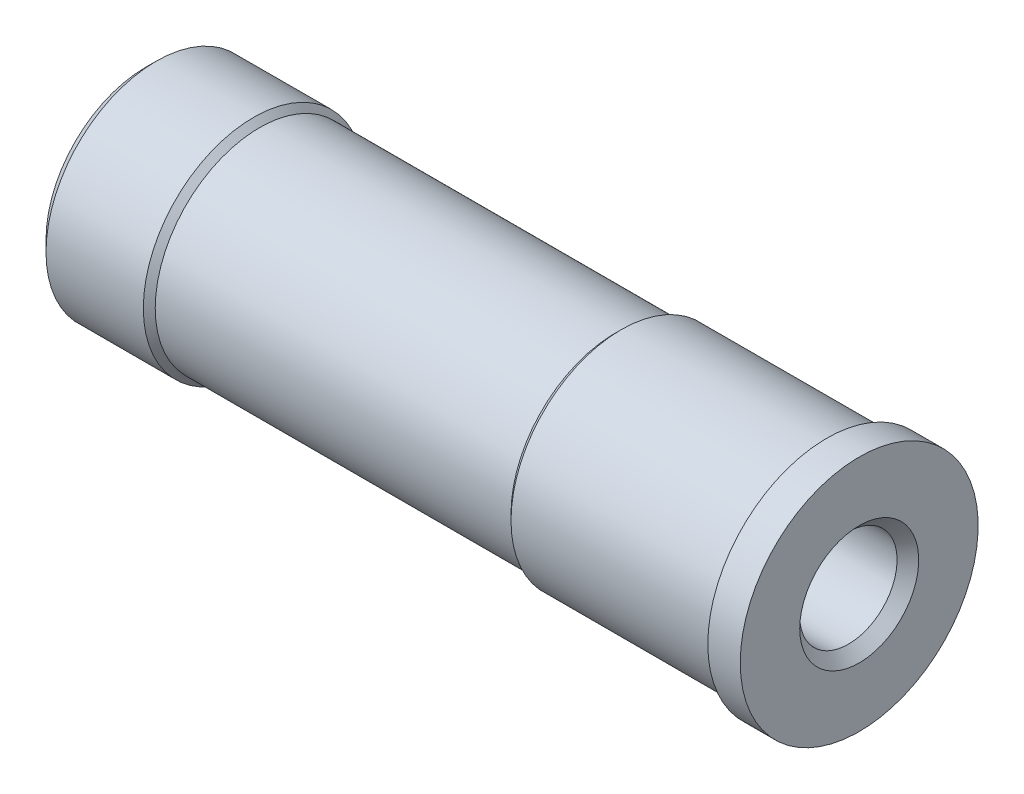
ISO-10303-21;
HEADER;
FILE_DESCRIPTION(('STEP AP214'),'2;1');
FILE_NAME('part.step','',(''),(''),'','','');
FILE_SCHEMA(('AUTOMOTIVE_DESIGN { 1 0 10303 214 1 1 1 1 }'));
ENDSEC;
DATA;
#1=APPLICATION_CONTEXT('core data for automotive mechanical design processes');
#2=APPLICATION_PROTOCOL_DEFINITION('international standard','automotive_design',2000,#1);
#3=PRODUCT_CONTEXT('',#1,'mechanical');
#4=PRODUCT('Part','Part','',(#3));
#5=PRODUCT_RELATED_PRODUCT_CATEGORY('part','',(#4));
#6=PRODUCT_DEFINITION_FORMATION('','',#4);
#7=PRODUCT_DEFINITION_CONTEXT('part definition',#1,'design');
#8=PRODUCT_DEFINITION('design','',#6,#7);
#9=PRODUCT_DEFINITION_SHAPE('','',#8);
#10=(LENGTH_UNIT() NAMED_UNIT(*) SI_UNIT(.MILLI.,.METRE.));
#11=(NAMED_UNIT(*) PLANE_ANGLE_UNIT() SI_UNIT($,.RADIAN.));
#12=(NAMED_UNIT(*) SI_UNIT($,.STERADIAN.) SOLID_ANGLE_UNIT());
#13=UNCERTAINTY_MEASURE_WITH_UNIT(LENGTH_MEASURE(1.E-05),#10,'distance_accuracy_value','');
#14=(GEOMETRIC_REPRESENTATION_CONTEXT(3) GLOBAL_UNCERTAINTY_ASSIGNED_CONTEXT((#13)) GLOBAL_UNIT_ASSIGNED_CONTEXT((#10,
#11,#12)) REPRESENTATION_CONTEXT('',''));
#15=CARTESIAN_POINT('',(0.,0.,0.));
#16=DIRECTION('',(0.,0.,1.));
#17=DIRECTION('',(1.,0.,0.));
#18=AXIS2_PLACEMENT_3D('',#15,#16,#17);
#19=CARTESIAN_POINT('',(0.,0.,0.));
#20=DIRECTION('',(-1.,0.,0.));
#21=DIRECTION('',(0.,0.,1.));
#22=AXIS2_PLACEMENT_3D('',#19,#20,#21);
#23=CYLINDRICAL_SURFACE('',#22,10.2);
#24=CARTESIAN_POINT('',(9.99999999999998,0.,0.));
#25=DIRECTION('',(-1.,0.,0.));
#26=DIRECTION('',(0.,0.,1.));
#27=AXIS2_PLACEMENT_3D('',#24,#25,#26);
#28=CIRCLE('',#27,10.2);
#29=CARTESIAN_POINT('',(9.99999999999998,0.,10.2));
#30=VERTEX_POINT('',#29);
#31=EDGE_CURVE('E63',#30,#30,#28,.T.);
#32=ORIENTED_EDGE('',*,*,#31,.T.);
#33=EDGE_LOOP('',(#32));
#34=FACE_BOUND('',#33,.T.);
#35=CARTESIAN_POINT('',(1.,0.,0.));
#36=DIRECTION('',(1.,0.,0.));
#37=DIRECTION('',(0.,0.,-1.));
#38=AXIS2_PLACEMENT_3D('',#35,#36,#37);
#39=CIRCLE('',#38,10.2);
#40=CARTESIAN_POINT('',(1.,0.,-10.2));
#41=VERTEX_POINT('',#40);
#42=EDGE_CURVE('E66',#41,#41,#39,.T.);
#43=ORIENTED_EDGE('',*,*,#42,.T.);
#44=EDGE_LOOP('',(#43));
#45=FACE_BOUND('',#44,.T.);
#46=ADVANCED_FACE('F33',(#34,#45),#23,.T.);
#47=CARTESIAN_POINT('',(0.,0.,0.));
#48=DIRECTION('',(-1.,0.,0.));
#49=DIRECTION('',(0.,0.,1.));
#50=AXIS2_PLACEMENT_3D('',#47,#48,#49);
#51=CYLINDRICAL_SURFACE('',#50,9.65);
#52=CARTESIAN_POINT('',(43.45,0.,0.));
#53=DIRECTION('',(1.,0.,0.));
#54=DIRECTION('',(0.,0.,-1.));
#55=AXIS2_PLACEMENT_3D('',#52,#53,#54);
#56=CIRCLE('',#55,9.65);
#57=CARTESIAN_POINT('',(43.45,0.,-9.65));
#58=VERTEX_POINT('',#57);
#59=EDGE_CURVE('E54',#58,#58,#56,.F.);
#60=ORIENTED_EDGE('',*,*,#59,.T.);
#61=EDGE_LOOP('',(#60));
#62=FACE_BOUND('',#61,.T.);
#63=CARTESIAN_POINT('',(10.55,0.,0.));
#64=DIRECTION('',(-1.,0.,0.));
#65=DIRECTION('',(0.,0.,1.));
#66=AXIS2_PLACEMENT_3D('',#63,#64,#65);
#67=CIRCLE('',#66,9.65);
#68=CARTESIAN_POINT('',(10.55,0.,9.65));
#69=VERTEX_POINT('',#68);
#70=EDGE_CURVE('E57',#69,#69,#67,.F.);
#71=ORIENTED_EDGE('',*,*,#70,.T.);
#72=EDGE_LOOP('',(#71));
#73=FACE_BOUND('',#72,.T.);
#74=ADVANCED_FACE('F105',(#62,#73),#51,.T.);
#75=CARTESIAN_POINT('',(0.,0.,0.));
#76=DIRECTION('',(-1.,0.,0.));
#77=DIRECTION('',(0.,0.,1.));
#78=AXIS2_PLACEMENT_3D('',#75,#76,#77);
#79=CYLINDRICAL_SURFACE('',#78,10.2);
#80=CARTESIAN_POINT('',(44.,0.,0.));
#81=DIRECTION('',(1.,0.,0.));
#82=DIRECTION('',(0.,0.,-1.));
#83=AXIS2_PLACEMENT_3D('',#80,#81,#82);
#84=CIRCLE('',#83,10.2);
#85=CARTESIAN_POINT('',(44.,0.,-10.2));
#86=VERTEX_POINT('',#85);
#87=EDGE_CURVE('E60',#86,#86,#84,.T.);
#88=ORIENTED_EDGE('',*,*,#87,.T.);
#89=EDGE_LOOP('',(#88));
#90=FACE_BOUND('',#89,.T.);
#91=CARTESIAN_POINT('',(63.,0.,0.));
#92=DIRECTION('',(-1.,0.,0.));
#93=DIRECTION('',(0.,0.,1.));
#94=AXIS2_PLACEMENT_3D('',#91,#92,#93);
#95=CIRCLE('',#94,10.2);
#96=CARTESIAN_POINT('',(63.,0.,10.2));
#97=VERTEX_POINT('',#96);
#98=EDGE_CURVE('E72',#97,#97,#95,.T.);
#99=ORIENTED_EDGE('',*,*,#98,.T.);
#100=EDGE_LOOP('',(#99));
#101=FACE_BOUND('',#100,.T.);
#102=ADVANCED_FACE('F111',(#90,#101),#79,.T.);
#103=CARTESIAN_POINT('',(63.,10.2,0.));
#104=DIRECTION('',(1.,0.,0.));
#105=DIRECTION('',(0.,0.,-1.));
#106=AXIS2_PLACEMENT_3D('',#103,#104,#105);
#107=PLANE('',#106);
#108=ORIENTED_EDGE('',*,*,#98,.F.);
#109=EDGE_LOOP('',(#108));
#110=FACE_BOUND('',#109,.T.);
#111=CARTESIAN_POINT('',(63.,0.,0.));
#112=DIRECTION('',(-1.,0.,0.));
#113=DIRECTION('',(0.,0.,1.));
#114=AXIS2_PLACEMENT_3D('',#111,#112,#113);
#115=CIRCLE('',#114,11.);
#116=CARTESIAN_POINT('',(63.,0.,11.));
#117=VERTEX_POINT('',#116);
#118=EDGE_CURVE('E75',#117,#117,#115,.T.);
#119=ORIENTED_EDGE('',*,*,#118,.T.);
#120=EDGE_LOOP('',(#119));
#121=FACE_BOUND('',#120,.T.);
#122=ADVANCED_FACE('F215',(#110,#121),#107,.F.);
#123=CARTESIAN_POINT('',(0.,0.,0.));
#124=DIRECTION('',(-1.,0.,0.));
#125=DIRECTION('',(0.,0.,1.));
#126=AXIS2_PLACEMENT_3D('',#123,#124,#125);
#127=CYLINDRICAL_SURFACE('',#126,11.);
#128=ORIENTED_EDGE('',*,*,#118,.F.);
#129=EDGE_LOOP('',(#128));
#130=FACE_BOUND('',#129,.T.);
#131=CARTESIAN_POINT('',(66.,0.,0.));
#132=DIRECTION('',(-1.,0.,0.));
#133=DIRECTION('',(0.,0.,1.));
#134=AXIS2_PLACEMENT_3D('',#131,#132,#133);
#135=CIRCLE('',#134,11.);
#136=CARTESIAN_POINT('',(66.,0.,11.));
#137=VERTEX_POINT('',#136);
#138=EDGE_CURVE('E78',#137,#137,#135,.T.);
#139=ORIENTED_EDGE('',*,*,#138,.T.);
#140=EDGE_LOOP('',(#139));
#141=FACE_BOUND('',#140,.T.);
#142=ADVANCED_FACE('F193',(#130,#141),#127,.T.);
#143=CARTESIAN_POINT('',(66.,11.,0.));
#144=DIRECTION('',(-1.,0.,0.));
#145=DIRECTION('',(0.,0.,1.));
#146=AXIS2_PLACEMENT_3D('',#143,#144,#145);
#147=PLANE('',#146);
#148=CARTESIAN_POINT('',(66.,0.,0.));
#149=DIRECTION('',(-1.,0.,0.));
#150=DIRECTION('',(0.,0.,1.));
#151=AXIS2_PLACEMENT_3D('',#148,#149,#150);
#152=CIRCLE('',#151,5.5);
#153=CARTESIAN_POINT('',(66.,0.,5.5));
#154=VERTEX_POINT('',#153);
#155=EDGE_CURVE('E41',#154,#154,#152,.T.);
#156=ORIENTED_EDGE('',*,*,#155,.T.);
#157=EDGE_LOOP('',(#156));
#158=FACE_BOUND('',#157,.T.);
#159=ORIENTED_EDGE('',*,*,#138,.F.);
#160=EDGE_LOOP('',(#159));
#161=FACE_BOUND('',#160,.T.);
#162=ADVANCED_FACE('F182',(#158,#161),#147,.F.);
#163=CARTESIAN_POINT('',(0.,0.,0.));
#164=DIRECTION('',(-1.,0.,0.));
#165=DIRECTION('',(0.,0.,1.));
#166=AXIS2_PLACEMENT_3D('',#163,#164,#165);
#167=CYLINDRICAL_SURFACE('',#166,4.5);
#168=CARTESIAN_POINT('',(65.,0.,0.));
#169=DIRECTION('',(-1.,0.,0.));
#170=DIRECTION('',(0.,0.,1.));
#171=AXIS2_PLACEMENT_3D('',#168,#169,#170);
#172=CIRCLE('',#171,4.5);
#173=CARTESIAN_POINT('',(65.,0.,4.5));
#174=VERTEX_POINT('',#173);
#175=EDGE_CURVE('E10',#174,#174,#172,.F.);
#176=ORIENTED_EDGE('',*,*,#175,.T.);
#177=EDGE_LOOP('',(#176));
#178=FACE_BOUND('',#177,.T.);
#179=CARTESIAN_POINT('',(42.,0.,0.));
#180=DIRECTION('',(-1.,0.,0.));
#181=DIRECTION('',(0.,0.,1.));
#182=AXIS2_PLACEMENT_3D('',#179,#180,#181);
#183=CIRCLE('',#182,4.5);
#184=CARTESIAN_POINT('',(42.,0.,4.5));
#185=VERTEX_POINT('',#184);
#186=EDGE_CURVE('E81',#185,#185,#183,.T.);
#187=ORIENTED_EDGE('',*,*,#186,.T.);
#188=EDGE_LOOP('',(#187));
#189=FACE_BOUND('',#188,.T.);
#190=ADVANCED_FACE('F177',(#178,#189),#167,.F.);
#191=CARTESIAN_POINT('',(42.,4.5,0.));
#192=DIRECTION('',(-1.,0.,0.));
#193=DIRECTION('',(0.,0.,1.));
#194=AXIS2_PLACEMENT_3D('',#191,#192,#193);
#195=PLANE('',#194);
#196=ORIENTED_EDGE('',*,*,#186,.F.);
#197=EDGE_LOOP('',(#196));
#198=FACE_BOUND('',#197,.T.);
#199=ADVANCED_FACE('F102',(#198),#195,.F.);
#200=CARTESIAN_POINT('',(19.,0.,0.));
#201=DIRECTION('',(1.,0.,0.));
#202=DIRECTION('',(0.,0.,-1.));
#203=AXIS2_PLACEMENT_3D('',#200,#201,#202);
#204=PLANE('',#203);
#205=CARTESIAN_POINT('',(19.,0.,0.));
#206=DIRECTION('',(-1.,0.,0.));
#207=DIRECTION('',(0.,0.,1.));
#208=AXIS2_PLACEMENT_3D('',#205,#206,#207);
#209=CIRCLE('',#208,4.5);
#210=CARTESIAN_POINT('',(19.,0.,4.5));
#211=VERTEX_POINT('',#210);
#212=EDGE_CURVE('E84',#211,#211,#209,.T.);
#213=ORIENTED_EDGE('',*,*,#212,.T.);
#214=EDGE_LOOP('',(#213));
#215=FACE_BOUND('',#214,.T.);
#216=ADVANCED_FACE('F88',(#215),#204,.F.);
#217=CARTESIAN_POINT('',(0.,0.,0.));
#218=DIRECTION('',(-1.,0.,0.));
#219=DIRECTION('',(0.,0.,1.));
#220=AXIS2_PLACEMENT_3D('',#217,#218,#219);
#221=CYLINDRICAL_SURFACE('',#220,4.5);
#222=CARTESIAN_POINT('',(1.00000000000001,0.,0.));
#223=DIRECTION('',(1.,0.,0.));
#224=DIRECTION('',(0.,0.,-1.));
#225=AXIS2_PLACEMENT_3D('',#222,#223,#224);
#226=CIRCLE('',#225,4.5);
#227=CARTESIAN_POINT('',(1.00000000000001,0.,-4.5));
#228=VERTEX_POINT('',#227);
#229=EDGE_CURVE('E49',#228,#228,#226,.F.);
#230=ORIENTED_EDGE('',*,*,#229,.T.);
#231=EDGE_LOOP('',(#230));
#232=FACE_BOUND('',#231,.T.);
#233=ORIENTED_EDGE('',*,*,#212,.F.);
#234=EDGE_LOOP('',(#233));
#235=FACE_BOUND('',#234,.T.);
#236=ADVANCED_FACE('F90',(#232,#235),#221,.F.);
#237=CARTESIAN_POINT('',(0.,4.5,0.));
#238=DIRECTION('',(1.,0.,0.));
#239=DIRECTION('',(0.,0.,-1.));
#240=AXIS2_PLACEMENT_3D('',#237,#238,#239);
#241=PLANE('',#240);
#242=CARTESIAN_POINT('',(0.,0.,0.));
#243=DIRECTION('',(1.,0.,0.));
#244=DIRECTION('',(0.,0.,-1.));
#245=AXIS2_PLACEMENT_3D('',#242,#243,#244);
#246=CIRCLE('',#245,5.50000000000001);
#247=CARTESIAN_POINT('',(0.,0.,-5.50000000000001));
#248=VERTEX_POINT('',#247);
#249=EDGE_CURVE('E45',#248,#248,#246,.T.);
#250=ORIENTED_EDGE('',*,*,#249,.T.);
#251=EDGE_LOOP('',(#250));
#252=FACE_BOUND('',#251,.T.);
#253=CARTESIAN_POINT('',(0.,0.,0.));
#254=DIRECTION('',(1.,0.,0.));
#255=DIRECTION('',(0.,0.,-1.));
#256=AXIS2_PLACEMENT_3D('',#253,#254,#255);
#257=CIRCLE('',#256,9.2);
#258=CARTESIAN_POINT('',(0.,0.,-9.2));
#259=VERTEX_POINT('',#258);
#260=EDGE_CURVE('E69',#259,#259,#257,.F.);
#261=ORIENTED_EDGE('',*,*,#260,.T.);
#262=EDGE_LOOP('',(#261));
#263=FACE_BOUND('',#262,.T.);
#264=ADVANCED_FACE('F92',(#252,#263),#241,.F.);
#265=CARTESIAN_POINT('',(0.,0.,0.));
#266=DIRECTION('',(1.,0.,0.));
#267=DIRECTION('',(0.,0.,-1.));
#268=AXIS2_PLACEMENT_3D('',#265,#266,#267);
#269=CONICAL_SURFACE('',#268,9.2,0.785398163397447);
#270=ORIENTED_EDGE('',*,*,#42,.F.);
#271=EDGE_LOOP('',(#270));
#272=FACE_BOUND('',#271,.T.);
#273=ORIENTED_EDGE('',*,*,#260,.F.);
#274=EDGE_LOOP('',(#273));
#275=FACE_BOUND('',#274,.T.);
#276=ADVANCED_FACE('F99',(#272,#275),#269,.T.);
#277=CARTESIAN_POINT('',(9.99999999999998,0.,0.));
#278=DIRECTION('',(-1.,0.,0.));
#279=DIRECTION('',(0.,0.,1.));
#280=AXIS2_PLACEMENT_3D('',#277,#278,#279);
#281=CONICAL_SURFACE('',#280,10.2,0.785398163397443);
#282=ORIENTED_EDGE('',*,*,#70,.F.);
#283=EDGE_LOOP('',(#282));
#284=FACE_BOUND('',#283,.T.);
#285=ORIENTED_EDGE('',*,*,#31,.F.);
#286=EDGE_LOOP('',(#285));
#287=FACE_BOUND('',#286,.T.);
#288=ADVANCED_FACE('F123',(#284,#287),#281,.T.);
#289=CARTESIAN_POINT('',(43.,0.,0.));
#290=DIRECTION('',(1.,0.,0.));
#291=DIRECTION('',(0.,0.,-1.));
#292=AXIS2_PLACEMENT_3D('',#289,#290,#291);
#293=CONICAL_SURFACE('',#292,9.19999999999998,0.785398163397453);
#294=ORIENTED_EDGE('',*,*,#87,.F.);
#295=EDGE_LOOP('',(#294));
#296=FACE_BOUND('',#295,.T.);
#297=ORIENTED_EDGE('',*,*,#59,.F.);
#298=EDGE_LOOP('',(#297));
#299=FACE_BOUND('',#298,.T.);
#300=ADVANCED_FACE('F130',(#296,#299),#293,.T.);
#301=CARTESIAN_POINT('',(1.00000000000001,0.,0.));
#302=DIRECTION('',(-1.,0.,0.));
#303=DIRECTION('',(0.,0.,1.));
#304=AXIS2_PLACEMENT_3D('',#301,#302,#303);
#305=CONICAL_SURFACE('',#304,4.5,0.785398163397451);
#306=ORIENTED_EDGE('',*,*,#249,.F.);
#307=EDGE_LOOP('',(#306));
#308=FACE_BOUND('',#307,.T.);
#309=ORIENTED_EDGE('',*,*,#229,.F.);
#310=EDGE_LOOP('',(#309));
#311=FACE_BOUND('',#310,.T.);
#312=ADVANCED_FACE('F136',(#308,#311),#305,.F.);
#313=CARTESIAN_POINT('',(66.,0.,0.));
#314=DIRECTION('',(1.,0.,0.));
#315=DIRECTION('',(0.,0.,-1.));
#316=AXIS2_PLACEMENT_3D('',#313,#314,#315);
#317=CONICAL_SURFACE('',#316,5.5,0.785398163397445);
#318=ORIENTED_EDGE('',*,*,#175,.F.);
#319=EDGE_LOOP('',(#318));
#320=FACE_BOUND('',#319,.T.);
#321=ORIENTED_EDGE('',*,*,#155,.F.);
#322=EDGE_LOOP('',(#321));
#323=FACE_BOUND('',#322,.T.);
#324=ADVANCED_FACE('F36',(#320,#323),#317,.F.);
#325=CLOSED_SHELL('',(#46,#74,#102,#122,#142,#162,#190,#199,#216,#236,#264,#276,#288,#300,#312,#324));
#326=MANIFOLD_SOLID_BREP('B2',#325);
#327=ADVANCED_BREP_SHAPE_REPRESENTATION('',(#18,#326),#14);
#328=SHAPE_DEFINITION_REPRESENTATION(#9,#327);
ENDSEC;
END-ISO-10303-21;
